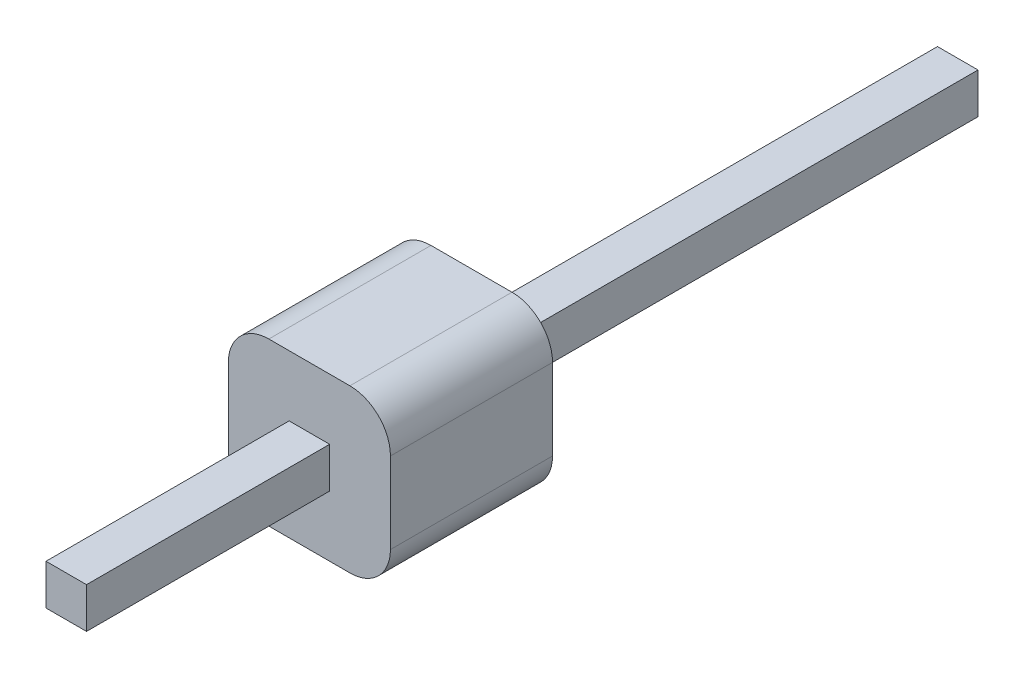
ISO-10303-21;
HEADER;
FILE_DESCRIPTION(('STEP AP214'),'2;1');
FILE_NAME('part.step','',(''),(''),'','','');
FILE_SCHEMA(('AUTOMOTIVE_DESIGN { 1 0 10303 214 1 1 1 1 }'));
ENDSEC;
DATA;
#1=APPLICATION_CONTEXT('core data for automotive mechanical design processes');
#2=APPLICATION_PROTOCOL_DEFINITION('international standard','automotive_design',2000,#1);
#3=PRODUCT_CONTEXT('',#1,'mechanical');
#4=PRODUCT('Part','Part','',(#3));
#5=PRODUCT_RELATED_PRODUCT_CATEGORY('part','',(#4));
#6=PRODUCT_DEFINITION_FORMATION('','',#4);
#7=PRODUCT_DEFINITION_CONTEXT('part definition',#1,'design');
#8=PRODUCT_DEFINITION('design','',#6,#7);
#9=PRODUCT_DEFINITION_SHAPE('','',#8);
#10=(LENGTH_UNIT() NAMED_UNIT(*) SI_UNIT(.MILLI.,.METRE.));
#11=(NAMED_UNIT(*) PLANE_ANGLE_UNIT() SI_UNIT($,.RADIAN.));
#12=(NAMED_UNIT(*) SI_UNIT($,.STERADIAN.) SOLID_ANGLE_UNIT());
#13=UNCERTAINTY_MEASURE_WITH_UNIT(LENGTH_MEASURE(1.E-05),#10,'distance_accuracy_value','');
#14=(GEOMETRIC_REPRESENTATION_CONTEXT(3) GLOBAL_UNCERTAINTY_ASSIGNED_CONTEXT((#13)) GLOBAL_UNIT_ASSIGNED_CONTEXT((#10,
#11,#12)) REPRESENTATION_CONTEXT('',''));
#15=CARTESIAN_POINT('',(0.,0.,0.));
#16=DIRECTION('',(0.,0.,1.));
#17=DIRECTION('',(1.,0.,0.));
#18=AXIS2_PLACEMENT_3D('',#15,#16,#17);
#19=CARTESIAN_POINT('',(-1.,-1.,2.));
#20=DIRECTION('',(0.,0.,1.));
#21=DIRECTION('',(1.,0.,0.));
#22=AXIS2_PLACEMENT_3D('',#19,#20,#21);
#23=PLANE('',#22);
#24=DIRECTION('',(1.,0.,0.));
#25=VECTOR('',#24,1.);
#26=CARTESIAN_POINT('',(-1.,-1.,2.));
#27=LINE('',#26,#25);
#28=CARTESIAN_POINT('',(-0.5,-1.,2.));
#29=VERTEX_POINT('',#28);
#30=CARTESIAN_POINT('',(0.500000000000001,-1.,2.));
#31=VERTEX_POINT('',#30);
#32=EDGE_CURVE('E193',#29,#31,#27,.T.);
#33=ORIENTED_EDGE('',*,*,#32,.T.);
#34=CARTESIAN_POINT('',(0.500000000000001,-0.5,2.));
#35=DIRECTION('',(0.,0.,1.));
#36=DIRECTION('',(1.,0.,0.));
#37=AXIS2_PLACEMENT_3D('',#34,#35,#36);
#38=CIRCLE('',#37,0.5);
#39=CARTESIAN_POINT('',(1.,-0.5,2.));
#40=VERTEX_POINT('',#39);
#41=EDGE_CURVE('E242',#31,#40,#38,.T.);
#42=ORIENTED_EDGE('',*,*,#41,.T.);
#43=DIRECTION('',(0.,1.,0.));
#44=VECTOR('',#43,1.);
#45=CARTESIAN_POINT('',(1.,1.,2.));
#46=LINE('',#45,#44);
#47=CARTESIAN_POINT('',(1.,0.5,2.));
#48=VERTEX_POINT('',#47);
#49=EDGE_CURVE('E197',#40,#48,#46,.T.);
#50=ORIENTED_EDGE('',*,*,#49,.T.);
#51=CARTESIAN_POINT('',(0.500000000000001,0.5,2.));
#52=DIRECTION('',(0.,0.,1.));
#53=DIRECTION('',(1.,0.,0.));
#54=AXIS2_PLACEMENT_3D('',#51,#52,#53);
#55=CIRCLE('',#54,0.5);
#56=CARTESIAN_POINT('',(0.500000000000001,1.,2.));
#57=VERTEX_POINT('',#56);
#58=EDGE_CURVE('E54',#48,#57,#55,.T.);
#59=ORIENTED_EDGE('',*,*,#58,.T.);
#60=DIRECTION('',(-1.,0.,0.));
#61=VECTOR('',#60,1.);
#62=CARTESIAN_POINT('',(-1.,1.,2.));
#63=LINE('',#62,#61);
#64=CARTESIAN_POINT('',(-0.5,1.,2.));
#65=VERTEX_POINT('',#64);
#66=EDGE_CURVE('E199',#57,#65,#63,.T.);
#67=ORIENTED_EDGE('',*,*,#66,.T.);
#68=CARTESIAN_POINT('',(-0.5,0.5,2.));
#69=DIRECTION('',(0.,0.,1.));
#70=DIRECTION('',(1.,0.,0.));
#71=AXIS2_PLACEMENT_3D('',#68,#69,#70);
#72=CIRCLE('',#71,0.5);
#73=CARTESIAN_POINT('',(-1.,0.5,2.));
#74=VERTEX_POINT('',#73);
#75=EDGE_CURVE('E238',#65,#74,#72,.T.);
#76=ORIENTED_EDGE('',*,*,#75,.T.);
#77=DIRECTION('',(0.,-1.,0.));
#78=VECTOR('',#77,1.);
#79=CARTESIAN_POINT('',(-1.,1.,2.));
#80=LINE('',#79,#78);
#81=CARTESIAN_POINT('',(-1.,-0.5,2.));
#82=VERTEX_POINT('',#81);
#83=EDGE_CURVE('E190',#74,#82,#80,.T.);
#84=ORIENTED_EDGE('',*,*,#83,.T.);
#85=CARTESIAN_POINT('',(-0.5,-0.5,2.));
#86=DIRECTION('',(0.,0.,1.));
#87=DIRECTION('',(1.,0.,0.));
#88=AXIS2_PLACEMENT_3D('',#85,#86,#87);
#89=CIRCLE('',#88,0.5);
#90=EDGE_CURVE('E240',#82,#29,#89,.T.);
#91=ORIENTED_EDGE('',*,*,#90,.T.);
#92=EDGE_LOOP('',(#33,#42,#50,#59,#67,#76,#84,#91));
#93=FACE_BOUND('',#92,.T.);
#94=DIRECTION('',(1.,0.,0.));
#95=VECTOR('',#94,1.);
#96=CARTESIAN_POINT('',(-0.999999999999999,0.25,2.));
#97=LINE('',#96,#95);
#98=CARTESIAN_POINT('',(-0.25,0.25,2.));
#99=VERTEX_POINT('',#98);
#100=CARTESIAN_POINT('',(0.25,0.25,2.));
#101=VERTEX_POINT('',#100);
#102=EDGE_CURVE('E172',#99,#101,#97,.T.);
#103=ORIENTED_EDGE('',*,*,#102,.T.);
#104=DIRECTION('',(0.,-1.,0.));
#105=VECTOR('',#104,1.);
#106=CARTESIAN_POINT('',(0.249999999999999,-1.,2.));
#107=LINE('',#106,#105);
#108=CARTESIAN_POINT('',(0.249999999999999,-0.25,2.));
#109=VERTEX_POINT('',#108);
#110=EDGE_CURVE('E186',#101,#109,#107,.T.);
#111=ORIENTED_EDGE('',*,*,#110,.T.);
#112=DIRECTION('',(-1.,0.,0.));
#113=VECTOR('',#112,1.);
#114=CARTESIAN_POINT('',(-1.,-0.25,2.));
#115=LINE('',#114,#113);
#116=CARTESIAN_POINT('',(-0.25,-0.25,2.));
#117=VERTEX_POINT('',#116);
#118=EDGE_CURVE('E183',#109,#117,#115,.T.);
#119=ORIENTED_EDGE('',*,*,#118,.T.);
#120=DIRECTION('',(0.,1.,0.));
#121=VECTOR('',#120,1.);
#122=CARTESIAN_POINT('',(-0.25,-1.,2.));
#123=LINE('',#122,#121);
#124=EDGE_CURVE('E176',#117,#99,#123,.T.);
#125=ORIENTED_EDGE('',*,*,#124,.T.);
#126=EDGE_LOOP('',(#103,#111,#119,#125));
#127=FACE_BOUND('',#126,.T.);
#128=ADVANCED_FACE('F34',(#93,#127),#23,.T.);
#129=CARTESIAN_POINT('',(-1.,-1.,0.));
#130=DIRECTION('',(0.,0.,1.));
#131=DIRECTION('',(1.,0.,0.));
#132=AXIS2_PLACEMENT_3D('',#129,#130,#131);
#133=PLANE('',#132);
#134=DIRECTION('',(0.,1.,0.));
#135=VECTOR('',#134,1.);
#136=CARTESIAN_POINT('',(1.,1.,0.));
#137=LINE('',#136,#135);
#138=CARTESIAN_POINT('',(1.,-0.5,0.));
#139=VERTEX_POINT('',#138);
#140=CARTESIAN_POINT('',(1.,0.5,0.));
#141=VERTEX_POINT('',#140);
#142=EDGE_CURVE('E207',#139,#141,#137,.T.);
#143=ORIENTED_EDGE('',*,*,#142,.F.);
#144=CARTESIAN_POINT('',(0.500000000000001,-0.5,0.));
#145=DIRECTION('',(0.,0.,1.));
#146=DIRECTION('',(1.,0.,0.));
#147=AXIS2_PLACEMENT_3D('',#144,#145,#146);
#148=CIRCLE('',#147,0.5);
#149=CARTESIAN_POINT('',(0.500000000000001,-1.,0.));
#150=VERTEX_POINT('',#149);
#151=EDGE_CURVE('E230',#139,#150,#148,.F.);
#152=ORIENTED_EDGE('',*,*,#151,.T.);
#153=DIRECTION('',(1.,0.,0.));
#154=VECTOR('',#153,1.);
#155=CARTESIAN_POINT('',(-1.,-1.,0.));
#156=LINE('',#155,#154);
#157=CARTESIAN_POINT('',(-0.5,-1.,0.));
#158=VERTEX_POINT('',#157);
#159=EDGE_CURVE('E204',#158,#150,#156,.T.);
#160=ORIENTED_EDGE('',*,*,#159,.F.);
#161=CARTESIAN_POINT('',(-0.5,-0.5,0.));
#162=DIRECTION('',(0.,0.,1.));
#163=DIRECTION('',(1.,0.,0.));
#164=AXIS2_PLACEMENT_3D('',#161,#162,#163);
#165=CIRCLE('',#164,0.5);
#166=CARTESIAN_POINT('',(-1.,-0.5,0.));
#167=VERTEX_POINT('',#166);
#168=EDGE_CURVE('E228',#158,#167,#165,.F.);
#169=ORIENTED_EDGE('',*,*,#168,.T.);
#170=DIRECTION('',(0.,-1.,0.));
#171=VECTOR('',#170,1.);
#172=CARTESIAN_POINT('',(-1.,1.,0.));
#173=LINE('',#172,#171);
#174=CARTESIAN_POINT('',(-1.,0.5,0.));
#175=VERTEX_POINT('',#174);
#176=EDGE_CURVE('E189',#175,#167,#173,.T.);
#177=ORIENTED_EDGE('',*,*,#176,.F.);
#178=CARTESIAN_POINT('',(-0.5,0.5,0.));
#179=DIRECTION('',(0.,0.,1.));
#180=DIRECTION('',(1.,0.,0.));
#181=AXIS2_PLACEMENT_3D('',#178,#179,#180);
#182=CIRCLE('',#181,0.5);
#183=CARTESIAN_POINT('',(-0.5,1.,0.));
#184=VERTEX_POINT('',#183);
#185=EDGE_CURVE('E226',#175,#184,#182,.F.);
#186=ORIENTED_EDGE('',*,*,#185,.T.);
#187=DIRECTION('',(-1.,0.,0.));
#188=VECTOR('',#187,1.);
#189=CARTESIAN_POINT('',(-1.,1.,0.));
#190=LINE('',#189,#188);
#191=CARTESIAN_POINT('',(0.500000000000001,1.,0.));
#192=VERTEX_POINT('',#191);
#193=EDGE_CURVE('E194',#192,#184,#190,.T.);
#194=ORIENTED_EDGE('',*,*,#193,.F.);
#195=CARTESIAN_POINT('',(0.500000000000001,0.5,0.));
#196=DIRECTION('',(0.,0.,1.));
#197=DIRECTION('',(1.,0.,0.));
#198=AXIS2_PLACEMENT_3D('',#195,#196,#197);
#199=CIRCLE('',#198,0.5);
#200=EDGE_CURVE('E224',#192,#141,#199,.F.);
#201=ORIENTED_EDGE('',*,*,#200,.T.);
#202=EDGE_LOOP('',(#143,#152,#160,#169,#177,#186,#194,#201));
#203=FACE_BOUND('',#202,.T.);
#204=DIRECTION('',(0.,-1.,0.));
#205=VECTOR('',#204,1.);
#206=CARTESIAN_POINT('',(0.249999999999999,-1.,0.));
#207=LINE('',#206,#205);
#208=CARTESIAN_POINT('',(0.25,0.250000000000001,0.));
#209=VERTEX_POINT('',#208);
#210=CARTESIAN_POINT('',(0.25,-0.25,0.));
#211=VERTEX_POINT('',#210);
#212=EDGE_CURVE('E171',#209,#211,#207,.T.);
#213=ORIENTED_EDGE('',*,*,#212,.F.);
#214=DIRECTION('',(1.,0.,0.));
#215=VECTOR('',#214,1.);
#216=CARTESIAN_POINT('',(-0.999999999999999,0.250000000000001,0.));
#217=LINE('',#216,#215);
#218=CARTESIAN_POINT('',(-0.25,0.250000000000001,0.));
#219=VERTEX_POINT('',#218);
#220=EDGE_CURVE('E201',#219,#209,#217,.T.);
#221=ORIENTED_EDGE('',*,*,#220,.F.);
#222=DIRECTION('',(0.,1.,0.));
#223=VECTOR('',#222,1.);
#224=CARTESIAN_POINT('',(-0.25,-1.,0.));
#225=LINE('',#224,#223);
#226=CARTESIAN_POINT('',(-0.25,-0.25,0.));
#227=VERTEX_POINT('',#226);
#228=EDGE_CURVE('E213',#227,#219,#225,.T.);
#229=ORIENTED_EDGE('',*,*,#228,.F.);
#230=DIRECTION('',(-1.,0.,0.));
#231=VECTOR('',#230,1.);
#232=CARTESIAN_POINT('',(-1.,-0.249999999999999,0.));
#233=LINE('',#232,#231);
#234=EDGE_CURVE('E216',#211,#227,#233,.T.);
#235=ORIENTED_EDGE('',*,*,#234,.F.);
#236=EDGE_LOOP('',(#213,#221,#229,#235));
#237=FACE_BOUND('',#236,.T.);
#238=ADVANCED_FACE('F255',(#203,#237),#133,.F.);
#239=CARTESIAN_POINT('',(-1.,1.,2.));
#240=DIRECTION('',(1.,0.,0.));
#241=DIRECTION('',(0.,0.,-1.));
#242=AXIS2_PLACEMENT_3D('',#239,#240,#241);
#243=PLANE('',#242);
#244=ORIENTED_EDGE('',*,*,#176,.T.);
#245=DIRECTION('',(0.,0.,-1.));
#246=VECTOR('',#245,1.);
#247=CARTESIAN_POINT('',(-1.,-0.5,2.));
#248=LINE('',#247,#246);
#249=EDGE_CURVE('E247',#167,#82,#248,.F.);
#250=ORIENTED_EDGE('',*,*,#249,.T.);
#251=ORIENTED_EDGE('',*,*,#83,.F.);
#252=DIRECTION('',(0.,0.,-1.));
#253=VECTOR('',#252,1.);
#254=CARTESIAN_POINT('',(-1.,0.5,2.));
#255=LINE('',#254,#253);
#256=EDGE_CURVE('E244',#74,#175,#255,.T.);
#257=ORIENTED_EDGE('',*,*,#256,.T.);
#258=EDGE_LOOP('',(#244,#250,#251,#257));
#259=FACE_BOUND('',#258,.T.);
#260=ADVANCED_FACE('F264',(#259),#243,.F.);
#261=CARTESIAN_POINT('',(-1.,-1.,2.));
#262=DIRECTION('',(0.,1.,0.));
#263=DIRECTION('',(-1.,0.,0.));
#264=AXIS2_PLACEMENT_3D('',#261,#262,#263);
#265=PLANE('',#264);
#266=ORIENTED_EDGE('',*,*,#159,.T.);
#267=DIRECTION('',(0.,0.,-1.));
#268=VECTOR('',#267,1.);
#269=CARTESIAN_POINT('',(0.500000000000001,-1.,2.));
#270=LINE('',#269,#268);
#271=EDGE_CURVE('E235',#150,#31,#270,.F.);
#272=ORIENTED_EDGE('',*,*,#271,.T.);
#273=ORIENTED_EDGE('',*,*,#32,.F.);
#274=DIRECTION('',(0.,0.,-1.));
#275=VECTOR('',#274,1.);
#276=CARTESIAN_POINT('',(-0.5,-1.,2.));
#277=LINE('',#276,#275);
#278=EDGE_CURVE('E232',#29,#158,#277,.T.);
#279=ORIENTED_EDGE('',*,*,#278,.T.);
#280=EDGE_LOOP('',(#266,#272,#273,#279));
#281=FACE_BOUND('',#280,.T.);
#282=ADVANCED_FACE('F274',(#281),#265,.F.);
#283=CARTESIAN_POINT('',(1.,1.,2.));
#284=DIRECTION('',(-1.,0.,0.));
#285=DIRECTION('',(0.,-1.,0.));
#286=AXIS2_PLACEMENT_3D('',#283,#284,#285);
#287=PLANE('',#286);
#288=ORIENTED_EDGE('',*,*,#49,.F.);
#289=DIRECTION('',(0.,0.,-1.));
#290=VECTOR('',#289,1.);
#291=CARTESIAN_POINT('',(1.,-0.5,2.));
#292=LINE('',#291,#290);
#293=EDGE_CURVE('E221',#40,#139,#292,.T.);
#294=ORIENTED_EDGE('',*,*,#293,.T.);
#295=ORIENTED_EDGE('',*,*,#142,.T.);
#296=DIRECTION('',(0.,0.,-1.));
#297=VECTOR('',#296,1.);
#298=CARTESIAN_POINT('',(1.,0.5,2.));
#299=LINE('',#298,#297);
#300=EDGE_CURVE('E219',#141,#48,#299,.F.);
#301=ORIENTED_EDGE('',*,*,#300,.T.);
#302=EDGE_LOOP('',(#288,#294,#295,#301));
#303=FACE_BOUND('',#302,.T.);
#304=ADVANCED_FACE('F282',(#303),#287,.F.);
#305=CARTESIAN_POINT('',(-1.,1.,2.));
#306=DIRECTION('',(0.,-1.,0.));
#307=DIRECTION('',(1.,0.,0.));
#308=AXIS2_PLACEMENT_3D('',#305,#306,#307);
#309=PLANE('',#308);
#310=ORIENTED_EDGE('',*,*,#193,.T.);
#311=DIRECTION('',(0.,0.,-1.));
#312=VECTOR('',#311,1.);
#313=CARTESIAN_POINT('',(-0.5,1.,2.));
#314=LINE('',#313,#312);
#315=EDGE_CURVE('E11',#184,#65,#314,.F.);
#316=ORIENTED_EDGE('',*,*,#315,.T.);
#317=ORIENTED_EDGE('',*,*,#66,.F.);
#318=DIRECTION('',(0.,0.,-1.));
#319=VECTOR('',#318,1.);
#320=CARTESIAN_POINT('',(0.500000000000001,1.,2.));
#321=LINE('',#320,#319);
#322=EDGE_CURVE('E42',#57,#192,#321,.T.);
#323=ORIENTED_EDGE('',*,*,#322,.T.);
#324=EDGE_LOOP('',(#310,#316,#317,#323));
#325=FACE_BOUND('',#324,.T.);
#326=ADVANCED_FACE('F251',(#325),#309,.F.);
#327=CARTESIAN_POINT('',(0.249999999999999,-0.249999999999999,-6.));
#328=DIRECTION('',(0.,0.,-1.));
#329=DIRECTION('',(-1.,0.,0.));
#330=AXIS2_PLACEMENT_3D('',#327,#328,#329);
#331=PLANE('',#330);
#332=DIRECTION('',(0.,-1.,0.));
#333=VECTOR('',#332,1.);
#334=CARTESIAN_POINT('',(0.25,0.250000000000001,-6.));
#335=LINE('',#334,#333);
#336=CARTESIAN_POINT('',(0.25,0.250000000000001,-6.));
#337=VERTEX_POINT('',#336);
#338=CARTESIAN_POINT('',(0.249999999999999,-0.249999999999999,-6.));
#339=VERTEX_POINT('',#338);
#340=EDGE_CURVE('E158',#337,#339,#335,.T.);
#341=ORIENTED_EDGE('',*,*,#340,.T.);
#342=DIRECTION('',(-1.,0.,0.));
#343=VECTOR('',#342,1.);
#344=CARTESIAN_POINT('',(0.249999999999999,-0.249999999999999,-6.));
#345=LINE('',#344,#343);
#346=CARTESIAN_POINT('',(-0.25,-0.249999999999999,-6.));
#347=VERTEX_POINT('',#346);
#348=EDGE_CURVE('E147',#339,#347,#345,.T.);
#349=ORIENTED_EDGE('',*,*,#348,.T.);
#350=DIRECTION('',(0.,1.,0.));
#351=VECTOR('',#350,1.);
#352=CARTESIAN_POINT('',(-0.25,0.250000000000001,-6.));
#353=LINE('',#352,#351);
#354=CARTESIAN_POINT('',(-0.25,0.250000000000001,-6.));
#355=VERTEX_POINT('',#354);
#356=EDGE_CURVE('E157',#347,#355,#353,.T.);
#357=ORIENTED_EDGE('',*,*,#356,.T.);
#358=DIRECTION('',(1.,0.,0.));
#359=VECTOR('',#358,1.);
#360=CARTESIAN_POINT('',(0.25,0.250000000000001,-6.));
#361=LINE('',#360,#359);
#362=EDGE_CURVE('E163',#355,#337,#361,.T.);
#363=ORIENTED_EDGE('',*,*,#362,.T.);
#364=EDGE_LOOP('',(#341,#349,#357,#363));
#365=FACE_BOUND('',#364,.T.);
#366=ADVANCED_FACE('F161',(#365),#331,.T.);
#367=CARTESIAN_POINT('',(0.25,0.250000000000001,-6.));
#368=DIRECTION('',(0.,-1.,0.));
#369=DIRECTION('',(0.,0.,-1.));
#370=AXIS2_PLACEMENT_3D('',#367,#368,#369);
#371=PLANE('',#370);
#372=DIRECTION('',(0.,0.,1.));
#373=VECTOR('',#372,1.);
#374=CARTESIAN_POINT('',(-0.25,0.250000000000001,-6.));
#375=LINE('',#374,#373);
#376=EDGE_CURVE('E454',#355,#219,#375,.T.);
#377=ORIENTED_EDGE('',*,*,#376,.T.);
#378=ORIENTED_EDGE('',*,*,#220,.T.);
#379=DIRECTION('',(0.,0.,1.));
#380=VECTOR('',#379,1.);
#381=CARTESIAN_POINT('',(0.25,0.250000000000001,-6.));
#382=LINE('',#381,#380);
#383=EDGE_CURVE('E457',#337,#209,#382,.T.);
#384=ORIENTED_EDGE('',*,*,#383,.F.);
#385=ORIENTED_EDGE('',*,*,#362,.F.);
#386=EDGE_LOOP('',(#377,#378,#384,#385));
#387=FACE_BOUND('',#386,.T.);
#388=ADVANCED_FACE('F351',(#387),#371,.F.);
#389=CARTESIAN_POINT('',(-0.25,0.250000000000001,-6.));
#390=DIRECTION('',(1.,0.,0.));
#391=DIRECTION('',(0.,0.,-1.));
#392=AXIS2_PLACEMENT_3D('',#389,#390,#391);
#393=PLANE('',#392);
#394=DIRECTION('',(0.,0.,1.));
#395=VECTOR('',#394,1.);
#396=CARTESIAN_POINT('',(-0.25,-0.249999999999999,-6.));
#397=LINE('',#396,#395);
#398=EDGE_CURVE('E154',#347,#227,#397,.T.);
#399=ORIENTED_EDGE('',*,*,#398,.T.);
#400=ORIENTED_EDGE('',*,*,#228,.T.);
#401=ORIENTED_EDGE('',*,*,#376,.F.);
#402=ORIENTED_EDGE('',*,*,#356,.F.);
#403=EDGE_LOOP('',(#399,#400,#401,#402));
#404=FACE_BOUND('',#403,.T.);
#405=ADVANCED_FACE('F361',(#404),#393,.F.);
#406=CARTESIAN_POINT('',(0.249999999999999,-0.249999999999999,-6.));
#407=DIRECTION('',(0.,1.,0.));
#408=DIRECTION('',(-1.,0.,0.));
#409=AXIS2_PLACEMENT_3D('',#406,#407,#408);
#410=PLANE('',#409);
#411=DIRECTION('',(0.,0.,1.));
#412=VECTOR('',#411,1.);
#413=CARTESIAN_POINT('',(0.249999999999999,-0.249999999999999,-6.));
#414=LINE('',#413,#412);
#415=EDGE_CURVE('E152',#339,#211,#414,.T.);
#416=ORIENTED_EDGE('',*,*,#415,.T.);
#417=ORIENTED_EDGE('',*,*,#234,.T.);
#418=ORIENTED_EDGE('',*,*,#398,.F.);
#419=ORIENTED_EDGE('',*,*,#348,.F.);
#420=EDGE_LOOP('',(#416,#417,#418,#419));
#421=FACE_BOUND('',#420,.T.);
#422=ADVANCED_FACE('F149',(#421),#410,.F.);
#423=CARTESIAN_POINT('',(0.25,0.250000000000001,-6.));
#424=DIRECTION('',(-1.,0.,0.));
#425=DIRECTION('',(0.,-1.,0.));
#426=AXIS2_PLACEMENT_3D('',#423,#424,#425);
#427=PLANE('',#426);
#428=ORIENTED_EDGE('',*,*,#383,.T.);
#429=ORIENTED_EDGE('',*,*,#212,.T.);
#430=ORIENTED_EDGE('',*,*,#415,.F.);
#431=ORIENTED_EDGE('',*,*,#340,.F.);
#432=EDGE_LOOP('',(#428,#429,#430,#431));
#433=FACE_BOUND('',#432,.T.);
#434=ADVANCED_FACE('F170',(#433),#427,.F.);
#435=ORIENTED_EDGE('',*,*,#110,.F.);
#436=CARTESIAN_POINT('',(0.25,0.25,5.));
#437=VERTEX_POINT('',#436);
#438=EDGE_CURVE('E460',#101,#437,#382,.T.);
#439=ORIENTED_EDGE('',*,*,#438,.T.);
#440=DIRECTION('',(0.,-1.,0.));
#441=VECTOR('',#440,1.);
#442=CARTESIAN_POINT('',(0.25,0.25,5.));
#443=LINE('',#442,#441);
#444=CARTESIAN_POINT('',(0.249999999999999,-0.25,5.));
#445=VERTEX_POINT('',#444);
#446=EDGE_CURVE('E469',#437,#445,#443,.T.);
#447=ORIENTED_EDGE('',*,*,#446,.T.);
#448=EDGE_CURVE('E173',#109,#445,#414,.T.);
#449=ORIENTED_EDGE('',*,*,#448,.F.);
#450=EDGE_LOOP('',(#435,#439,#447,#449));
#451=FACE_BOUND('',#450,.T.);
#452=ADVANCED_FACE('F295',(#451),#427,.F.);
#453=ORIENTED_EDGE('',*,*,#118,.F.);
#454=ORIENTED_EDGE('',*,*,#448,.T.);
#455=DIRECTION('',(-1.,0.,0.));
#456=VECTOR('',#455,1.);
#457=CARTESIAN_POINT('',(0.249999999999999,-0.25,5.));
#458=LINE('',#457,#456);
#459=CARTESIAN_POINT('',(-0.25,-0.25,5.));
#460=VERTEX_POINT('',#459);
#461=EDGE_CURVE('E466',#445,#460,#458,.T.);
#462=ORIENTED_EDGE('',*,*,#461,.T.);
#463=EDGE_CURVE('E455',#117,#460,#397,.T.);
#464=ORIENTED_EDGE('',*,*,#463,.F.);
#465=EDGE_LOOP('',(#453,#454,#462,#464));
#466=FACE_BOUND('',#465,.T.);
#467=ADVANCED_FACE('F358',(#466),#410,.F.);
#468=ORIENTED_EDGE('',*,*,#124,.F.);
#469=ORIENTED_EDGE('',*,*,#463,.T.);
#470=DIRECTION('',(0.,1.,0.));
#471=VECTOR('',#470,1.);
#472=CARTESIAN_POINT('',(-0.25,0.25,5.));
#473=LINE('',#472,#471);
#474=CARTESIAN_POINT('',(-0.25,0.25,5.));
#475=VERTEX_POINT('',#474);
#476=EDGE_CURVE('E463',#460,#475,#473,.T.);
#477=ORIENTED_EDGE('',*,*,#476,.T.);
#478=EDGE_CURVE('E456',#99,#475,#375,.T.);
#479=ORIENTED_EDGE('',*,*,#478,.F.);
#480=EDGE_LOOP('',(#468,#469,#477,#479));
#481=FACE_BOUND('',#480,.T.);
#482=ADVANCED_FACE('F348',(#481),#393,.F.);
#483=ORIENTED_EDGE('',*,*,#102,.F.);
#484=ORIENTED_EDGE('',*,*,#478,.T.);
#485=DIRECTION('',(1.,0.,0.));
#486=VECTOR('',#485,1.);
#487=CARTESIAN_POINT('',(0.25,0.25,5.));
#488=LINE('',#487,#486);
#489=EDGE_CURVE('E167',#475,#437,#488,.T.);
#490=ORIENTED_EDGE('',*,*,#489,.T.);
#491=ORIENTED_EDGE('',*,*,#438,.F.);
#492=EDGE_LOOP('',(#483,#484,#490,#491));
#493=FACE_BOUND('',#492,.T.);
#494=ADVANCED_FACE('F339',(#493),#371,.F.);
#495=CARTESIAN_POINT('',(0.249999999999999,-0.25,5.));
#496=DIRECTION('',(0.,0.,-1.));
#497=DIRECTION('',(-1.,0.,0.));
#498=AXIS2_PLACEMENT_3D('',#495,#496,#497);
#499=PLANE('',#498);
#500=ORIENTED_EDGE('',*,*,#446,.F.);
#501=ORIENTED_EDGE('',*,*,#489,.F.);
#502=ORIENTED_EDGE('',*,*,#476,.F.);
#503=ORIENTED_EDGE('',*,*,#461,.F.);
#504=EDGE_LOOP('',(#500,#501,#502,#503));
#505=FACE_BOUND('',#504,.T.);
#506=ADVANCED_FACE('F308',(#505),#499,.F.);
#507=CARTESIAN_POINT('',(0.500000000000001,-0.5,2.));
#508=DIRECTION('',(0.,0.,-1.));
#509=DIRECTION('',(-1.,0.,0.));
#510=AXIS2_PLACEMENT_3D('',#507,#508,#509);
#511=CYLINDRICAL_SURFACE('',#510,0.5);
#512=ORIENTED_EDGE('',*,*,#41,.F.);
#513=ORIENTED_EDGE('',*,*,#271,.F.);
#514=ORIENTED_EDGE('',*,*,#151,.F.);
#515=ORIENTED_EDGE('',*,*,#293,.F.);
#516=EDGE_LOOP('',(#512,#513,#514,#515));
#517=FACE_BOUND('',#516,.T.);
#518=ADVANCED_FACE('F279',(#517),#511,.T.);
#519=CARTESIAN_POINT('',(-0.5,-0.5,2.));
#520=DIRECTION('',(0.,0.,-1.));
#521=DIRECTION('',(-1.,0.,0.));
#522=AXIS2_PLACEMENT_3D('',#519,#520,#521);
#523=CYLINDRICAL_SURFACE('',#522,0.5);
#524=ORIENTED_EDGE('',*,*,#90,.F.);
#525=ORIENTED_EDGE('',*,*,#249,.F.);
#526=ORIENTED_EDGE('',*,*,#168,.F.);
#527=ORIENTED_EDGE('',*,*,#278,.F.);
#528=EDGE_LOOP('',(#524,#525,#526,#527));
#529=FACE_BOUND('',#528,.T.);
#530=ADVANCED_FACE('F271',(#529),#523,.T.);
#531=CARTESIAN_POINT('',(-0.5,0.5,2.));
#532=DIRECTION('',(0.,0.,-1.));
#533=DIRECTION('',(-1.,0.,0.));
#534=AXIS2_PLACEMENT_3D('',#531,#532,#533);
#535=CYLINDRICAL_SURFACE('',#534,0.5);
#536=ORIENTED_EDGE('',*,*,#75,.F.);
#537=ORIENTED_EDGE('',*,*,#315,.F.);
#538=ORIENTED_EDGE('',*,*,#185,.F.);
#539=ORIENTED_EDGE('',*,*,#256,.F.);
#540=EDGE_LOOP('',(#536,#537,#538,#539));
#541=FACE_BOUND('',#540,.T.);
#542=ADVANCED_FACE('F261',(#541),#535,.T.);
#543=CARTESIAN_POINT('',(0.500000000000001,0.5,2.));
#544=DIRECTION('',(0.,0.,-1.));
#545=DIRECTION('',(-1.,0.,0.));
#546=AXIS2_PLACEMENT_3D('',#543,#544,#545);
#547=CYLINDRICAL_SURFACE('',#546,0.5);
#548=ORIENTED_EDGE('',*,*,#58,.F.);
#549=ORIENTED_EDGE('',*,*,#300,.F.);
#550=ORIENTED_EDGE('',*,*,#200,.F.);
#551=ORIENTED_EDGE('',*,*,#322,.F.);
#552=EDGE_LOOP('',(#548,#549,#550,#551));
#553=FACE_BOUND('',#552,.T.);
#554=ADVANCED_FACE('F36',(#553),#547,.T.);
#555=CLOSED_SHELL('',(#128,#238,#260,#282,#304,#326,#366,#388,#405,#422,#434,#452,#467,#482,
#494,#506,#518,#530,#542,#554));
#556=MANIFOLD_SOLID_BREP('B2',#555);
#557=ADVANCED_BREP_SHAPE_REPRESENTATION('',(#18,#556),#14);
#558=SHAPE_DEFINITION_REPRESENTATION(#9,#557);
ENDSEC;
END-ISO-10303-21;
